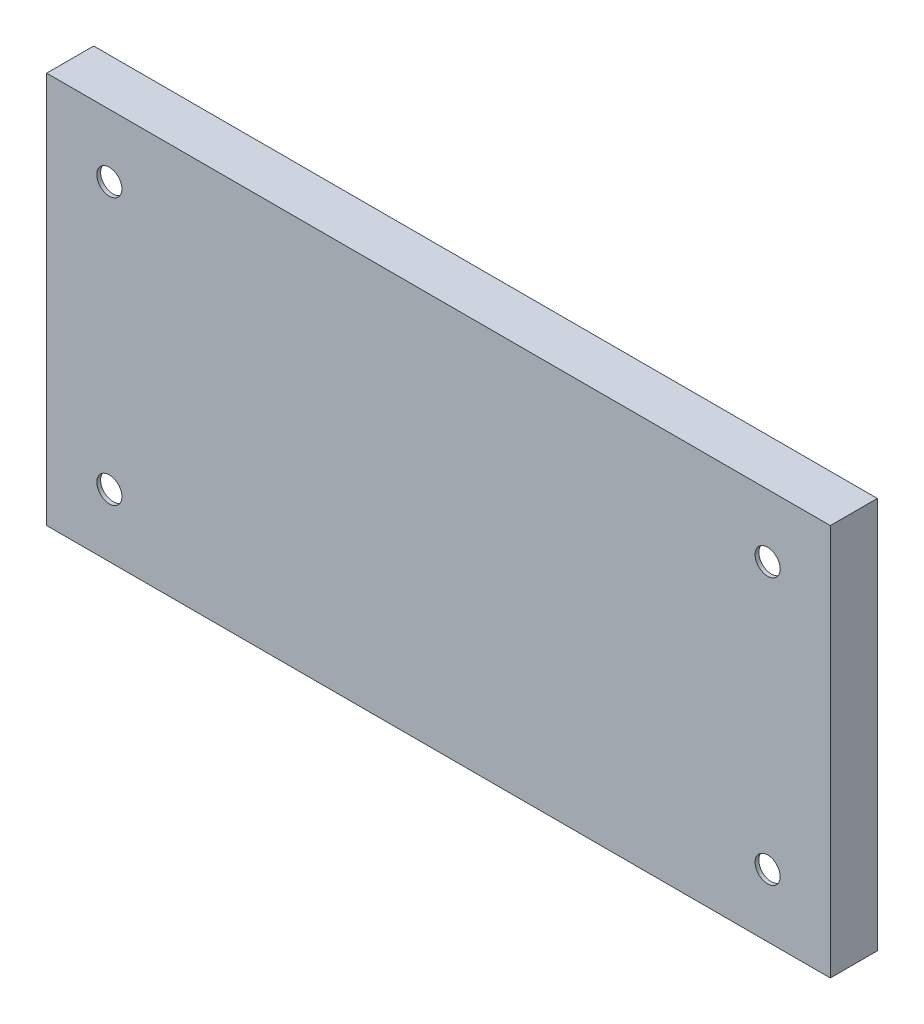
ISO-10303-21;
HEADER;
FILE_DESCRIPTION(('STEP AP214'),'2;1');
FILE_NAME('part.step','',(''),(''),'','','');
FILE_SCHEMA(('AUTOMOTIVE_DESIGN { 1 0 10303 214 1 1 1 1 }'));
ENDSEC;
DATA;
#1=APPLICATION_CONTEXT('core data for automotive mechanical design processes');
#2=APPLICATION_PROTOCOL_DEFINITION('international standard','automotive_design',2000,#1);
#3=PRODUCT_CONTEXT('',#1,'mechanical');
#4=PRODUCT('Part','Part','',(#3));
#5=PRODUCT_RELATED_PRODUCT_CATEGORY('part','',(#4));
#6=PRODUCT_DEFINITION_FORMATION('','',#4);
#7=PRODUCT_DEFINITION_CONTEXT('part definition',#1,'design');
#8=PRODUCT_DEFINITION('design','',#6,#7);
#9=PRODUCT_DEFINITION_SHAPE('','',#8);
#10=(LENGTH_UNIT() NAMED_UNIT(*) SI_UNIT(.MILLI.,.METRE.));
#11=(NAMED_UNIT(*) PLANE_ANGLE_UNIT() SI_UNIT($,.RADIAN.));
#12=(NAMED_UNIT(*) SI_UNIT($,.STERADIAN.) SOLID_ANGLE_UNIT());
#13=UNCERTAINTY_MEASURE_WITH_UNIT(LENGTH_MEASURE(1.E-05),#10,'distance_accuracy_value','');
#14=(GEOMETRIC_REPRESENTATION_CONTEXT(3) GLOBAL_UNCERTAINTY_ASSIGNED_CONTEXT((#13)) GLOBAL_UNIT_ASSIGNED_CONTEXT((#10,
#11,#12)) REPRESENTATION_CONTEXT('',''));
#15=CARTESIAN_POINT('',(0.,0.,0.));
#16=DIRECTION('',(0.,0.,1.));
#17=DIRECTION('',(1.,0.,0.));
#18=AXIS2_PLACEMENT_3D('',#15,#16,#17);
#19=CARTESIAN_POINT('',(-125.,-62.5,15.));
#20=DIRECTION('',(0.,1.,0.));
#21=DIRECTION('',(-1.,0.,0.));
#22=AXIS2_PLACEMENT_3D('',#19,#20,#21);
#23=PLANE('',#22);
#24=DIRECTION('',(1.,0.,0.));
#25=VECTOR('',#24,1.);
#26=CARTESIAN_POINT('',(-125.,-62.5,0.));
#27=LINE('',#26,#25);
#28=CARTESIAN_POINT('',(-125.,-62.5,0.));
#29=VERTEX_POINT('',#28);
#30=CARTESIAN_POINT('',(125.,-62.5,0.));
#31=VERTEX_POINT('',#30);
#32=EDGE_CURVE('E132',#29,#31,#27,.T.);
#33=ORIENTED_EDGE('',*,*,#32,.T.);
#34=DIRECTION('',(0.,0.,-1.));
#35=VECTOR('',#34,1.);
#36=CARTESIAN_POINT('',(125.,-62.5,15.));
#37=LINE('',#36,#35);
#38=CARTESIAN_POINT('',(125.,-62.5,15.));
#39=VERTEX_POINT('',#38);
#40=EDGE_CURVE('E11',#39,#31,#37,.T.);
#41=ORIENTED_EDGE('',*,*,#40,.F.);
#42=DIRECTION('',(1.,0.,0.));
#43=VECTOR('',#42,1.);
#44=CARTESIAN_POINT('',(-125.,-62.5,15.));
#45=LINE('',#44,#43);
#46=CARTESIAN_POINT('',(-125.,-62.5,15.));
#47=VERTEX_POINT('',#46);
#48=EDGE_CURVE('E156',#47,#39,#45,.T.);
#49=ORIENTED_EDGE('',*,*,#48,.F.);
#50=DIRECTION('',(0.,0.,-1.));
#51=VECTOR('',#50,1.);
#52=CARTESIAN_POINT('',(-125.,-62.5,15.));
#53=LINE('',#52,#51);
#54=EDGE_CURVE('E161',#47,#29,#53,.T.);
#55=ORIENTED_EDGE('',*,*,#54,.T.);
#56=EDGE_LOOP('',(#33,#41,#49,#55));
#57=FACE_BOUND('',#56,.T.);
#58=ADVANCED_FACE('F34',(#57),#23,.F.);
#59=CARTESIAN_POINT('',(125.,-62.5,15.));
#60=DIRECTION('',(-1.,0.,0.));
#61=DIRECTION('',(0.,0.,1.));
#62=AXIS2_PLACEMENT_3D('',#59,#60,#61);
#63=PLANE('',#62);
#64=DIRECTION('',(0.,1.,0.));
#65=VECTOR('',#64,1.);
#66=CARTESIAN_POINT('',(125.,-62.5,0.));
#67=LINE('',#66,#65);
#68=CARTESIAN_POINT('',(125.,62.5,0.));
#69=VERTEX_POINT('',#68);
#70=EDGE_CURVE('E136',#31,#69,#67,.T.);
#71=ORIENTED_EDGE('',*,*,#70,.T.);
#72=DIRECTION('',(0.,0.,-1.));
#73=VECTOR('',#72,1.);
#74=CARTESIAN_POINT('',(125.,62.5,15.));
#75=LINE('',#74,#73);
#76=CARTESIAN_POINT('',(125.,62.5,15.));
#77=VERTEX_POINT('',#76);
#78=EDGE_CURVE('E42',#77,#69,#75,.T.);
#79=ORIENTED_EDGE('',*,*,#78,.F.);
#80=DIRECTION('',(0.,1.,0.));
#81=VECTOR('',#80,1.);
#82=CARTESIAN_POINT('',(125.,-62.5,15.));
#83=LINE('',#82,#81);
#84=EDGE_CURVE('E87',#39,#77,#83,.T.);
#85=ORIENTED_EDGE('',*,*,#84,.F.);
#86=ORIENTED_EDGE('',*,*,#40,.T.);
#87=EDGE_LOOP('',(#71,#79,#85,#86));
#88=FACE_BOUND('',#87,.T.);
#89=ADVANCED_FACE('F200',(#88),#63,.F.);
#90=CARTESIAN_POINT('',(-125.,62.5,15.));
#91=DIRECTION('',(0.,-1.,0.));
#92=DIRECTION('',(0.,0.,-1.));
#93=AXIS2_PLACEMENT_3D('',#90,#91,#92);
#94=PLANE('',#93);
#95=DIRECTION('',(-1.,0.,0.));
#96=VECTOR('',#95,1.);
#97=CARTESIAN_POINT('',(-125.,62.5,0.));
#98=LINE('',#97,#96);
#99=CARTESIAN_POINT('',(-125.,62.5,0.));
#100=VERTEX_POINT('',#99);
#101=EDGE_CURVE('E164',#69,#100,#98,.T.);
#102=ORIENTED_EDGE('',*,*,#101,.T.);
#103=DIRECTION('',(0.,0.,-1.));
#104=VECTOR('',#103,1.);
#105=CARTESIAN_POINT('',(-125.,62.5,15.));
#106=LINE('',#105,#104);
#107=CARTESIAN_POINT('',(-125.,62.5,15.));
#108=VERTEX_POINT('',#107);
#109=EDGE_CURVE('E168',#108,#100,#106,.T.);
#110=ORIENTED_EDGE('',*,*,#109,.F.);
#111=DIRECTION('',(-1.,0.,0.));
#112=VECTOR('',#111,1.);
#113=CARTESIAN_POINT('',(-125.,62.5,15.));
#114=LINE('',#113,#112);
#115=EDGE_CURVE('E159',#77,#108,#114,.T.);
#116=ORIENTED_EDGE('',*,*,#115,.F.);
#117=ORIENTED_EDGE('',*,*,#78,.T.);
#118=EDGE_LOOP('',(#102,#110,#116,#117));
#119=FACE_BOUND('',#118,.T.);
#120=ADVANCED_FACE('F205',(#119),#94,.F.);
#121=CARTESIAN_POINT('',(-125.,-62.5,15.));
#122=DIRECTION('',(1.,0.,0.));
#123=DIRECTION('',(0.,0.,-1.));
#124=AXIS2_PLACEMENT_3D('',#121,#122,#123);
#125=PLANE('',#124);
#126=DIRECTION('',(0.,-1.,0.));
#127=VECTOR('',#126,1.);
#128=CARTESIAN_POINT('',(-125.,-62.5,0.));
#129=LINE('',#128,#127);
#130=EDGE_CURVE('E80',#100,#29,#129,.T.);
#131=ORIENTED_EDGE('',*,*,#130,.T.);
#132=ORIENTED_EDGE('',*,*,#54,.F.);
#133=DIRECTION('',(0.,-1.,0.));
#134=VECTOR('',#133,1.);
#135=CARTESIAN_POINT('',(-125.,-62.5,15.));
#136=LINE('',#135,#134);
#137=EDGE_CURVE('E59',#108,#47,#136,.T.);
#138=ORIENTED_EDGE('',*,*,#137,.F.);
#139=ORIENTED_EDGE('',*,*,#109,.T.);
#140=EDGE_LOOP('',(#131,#132,#138,#139));
#141=FACE_BOUND('',#140,.T.);
#142=ADVANCED_FACE('F193',(#141),#125,.F.);
#143=CARTESIAN_POINT('',(0.,0.,15.));
#144=DIRECTION('',(0.,0.,1.));
#145=DIRECTION('',(1.,0.,0.));
#146=AXIS2_PLACEMENT_3D('',#143,#144,#145);
#147=PLANE('',#146);
#148=CARTESIAN_POINT('',(105.,42.5,15.));
#149=DIRECTION('',(0.,0.,1.));
#150=DIRECTION('',(-1.,0.,0.));
#151=AXIS2_PLACEMENT_3D('',#148,#149,#150);
#152=CIRCLE('',#151,4.00000000000001);
#153=CARTESIAN_POINT('',(101.,42.5,15.));
#154=VERTEX_POINT('',#153);
#155=EDGE_CURVE('E177',#154,#154,#152,.T.);
#156=ORIENTED_EDGE('',*,*,#155,.F.);
#157=EDGE_LOOP('',(#156));
#158=FACE_BOUND('',#157,.T.);
#159=CARTESIAN_POINT('',(105.,-42.5,15.));
#160=DIRECTION('',(0.,0.,1.));
#161=DIRECTION('',(1.,0.,0.));
#162=AXIS2_PLACEMENT_3D('',#159,#160,#161);
#163=CIRCLE('',#162,4.00000000000001);
#164=CARTESIAN_POINT('',(109.,-42.5,15.));
#165=VERTEX_POINT('',#164);
#166=EDGE_CURVE('E324',#165,#165,#163,.T.);
#167=ORIENTED_EDGE('',*,*,#166,.F.);
#168=EDGE_LOOP('',(#167));
#169=FACE_BOUND('',#168,.T.);
#170=CARTESIAN_POINT('',(-105.,-42.5,15.));
#171=DIRECTION('',(0.,0.,1.));
#172=DIRECTION('',(-1.,0.,0.));
#173=AXIS2_PLACEMENT_3D('',#170,#171,#172);
#174=CIRCLE('',#173,4.00000000000001);
#175=CARTESIAN_POINT('',(-109.,-42.5,15.));
#176=VERTEX_POINT('',#175);
#177=EDGE_CURVE('E327',#176,#176,#174,.T.);
#178=ORIENTED_EDGE('',*,*,#177,.F.);
#179=EDGE_LOOP('',(#178));
#180=FACE_BOUND('',#179,.T.);
#181=CARTESIAN_POINT('',(-105.,42.5,15.));
#182=DIRECTION('',(0.,0.,1.));
#183=DIRECTION('',(1.,0.,0.));
#184=AXIS2_PLACEMENT_3D('',#181,#182,#183);
#185=CIRCLE('',#184,4.00000000000001);
#186=CARTESIAN_POINT('',(-101.,42.5,15.));
#187=VERTEX_POINT('',#186);
#188=EDGE_CURVE('E141',#187,#187,#185,.T.);
#189=ORIENTED_EDGE('',*,*,#188,.F.);
#190=EDGE_LOOP('',(#189));
#191=FACE_BOUND('',#190,.T.);
#192=ORIENTED_EDGE('',*,*,#48,.T.);
#193=ORIENTED_EDGE('',*,*,#84,.T.);
#194=ORIENTED_EDGE('',*,*,#115,.T.);
#195=ORIENTED_EDGE('',*,*,#137,.T.);
#196=EDGE_LOOP('',(#192,#193,#194,#195));
#197=FACE_BOUND('',#196,.T.);
#198=ADVANCED_FACE('F190',(#158,#169,#180,#191,#197),#147,.T.);
#199=CARTESIAN_POINT('',(0.,0.,0.));
#200=DIRECTION('',(0.,0.,1.));
#201=DIRECTION('',(1.,0.,0.));
#202=AXIS2_PLACEMENT_3D('',#199,#200,#201);
#203=PLANE('',#202);
#204=DIRECTION('',(0.,-1.,0.));
#205=VECTOR('',#204,1.);
#206=CARTESIAN_POINT('',(-123.8,-62.5,0.));
#207=LINE('',#206,#205);
#208=CARTESIAN_POINT('',(-123.8,61.3,0.));
#209=VERTEX_POINT('',#208);
#210=CARTESIAN_POINT('',(-123.8,-61.3,0.));
#211=VERTEX_POINT('',#210);
#212=EDGE_CURVE('E127',#209,#211,#207,.T.);
#213=ORIENTED_EDGE('',*,*,#212,.T.);
#214=DIRECTION('',(1.,0.,0.));
#215=VECTOR('',#214,1.);
#216=CARTESIAN_POINT('',(-125.,-61.3,0.));
#217=LINE('',#216,#215);
#218=CARTESIAN_POINT('',(123.8,-61.3,0.));
#219=VERTEX_POINT('',#218);
#220=EDGE_CURVE('E149',#211,#219,#217,.T.);
#221=ORIENTED_EDGE('',*,*,#220,.T.);
#222=DIRECTION('',(0.,1.,0.));
#223=VECTOR('',#222,1.);
#224=CARTESIAN_POINT('',(123.8,-62.5,0.));
#225=LINE('',#224,#223);
#226=CARTESIAN_POINT('',(123.8,61.3,0.));
#227=VERTEX_POINT('',#226);
#228=EDGE_CURVE('E131',#219,#227,#225,.T.);
#229=ORIENTED_EDGE('',*,*,#228,.T.);
#230=DIRECTION('',(-1.,0.,0.));
#231=VECTOR('',#230,1.);
#232=CARTESIAN_POINT('',(-125.,61.3,0.));
#233=LINE('',#232,#231);
#234=EDGE_CURVE('E50',#227,#209,#233,.T.);
#235=ORIENTED_EDGE('',*,*,#234,.T.);
#236=EDGE_LOOP('',(#213,#221,#229,#235));
#237=FACE_BOUND('',#236,.T.);
#238=ORIENTED_EDGE('',*,*,#32,.F.);
#239=ORIENTED_EDGE('',*,*,#130,.F.);
#240=ORIENTED_EDGE('',*,*,#101,.F.);
#241=ORIENTED_EDGE('',*,*,#70,.F.);
#242=EDGE_LOOP('',(#238,#239,#240,#241));
#243=FACE_BOUND('',#242,.T.);
#244=ADVANCED_FACE('F192',(#237,#243),#203,.F.);
#245=CARTESIAN_POINT('',(-125.,-61.3,15.));
#246=DIRECTION('',(0.,1.,0.));
#247=DIRECTION('',(-1.,0.,0.));
#248=AXIS2_PLACEMENT_3D('',#245,#246,#247);
#249=PLANE('',#248);
#250=ORIENTED_EDGE('',*,*,#220,.F.);
#251=DIRECTION('',(0.,0.,-1.));
#252=VECTOR('',#251,1.);
#253=CARTESIAN_POINT('',(-123.8,-61.3,15.));
#254=LINE('',#253,#252);
#255=CARTESIAN_POINT('',(-123.8,-61.3,13.8));
#256=VERTEX_POINT('',#255);
#257=EDGE_CURVE('E126',#256,#211,#254,.T.);
#258=ORIENTED_EDGE('',*,*,#257,.F.);
#259=DIRECTION('',(1.,0.,0.));
#260=VECTOR('',#259,1.);
#261=CARTESIAN_POINT('',(-125.,-61.3,13.8));
#262=LINE('',#261,#260);
#263=CARTESIAN_POINT('',(123.8,-61.3,13.8));
#264=VERTEX_POINT('',#263);
#265=EDGE_CURVE('E114',#256,#264,#262,.T.);
#266=ORIENTED_EDGE('',*,*,#265,.T.);
#267=DIRECTION('',(0.,0.,-1.));
#268=VECTOR('',#267,1.);
#269=CARTESIAN_POINT('',(123.8,-61.3,15.));
#270=LINE('',#269,#268);
#271=EDGE_CURVE('E124',#264,#219,#270,.T.);
#272=ORIENTED_EDGE('',*,*,#271,.T.);
#273=EDGE_LOOP('',(#250,#258,#266,#272));
#274=FACE_BOUND('',#273,.T.);
#275=ADVANCED_FACE('F123',(#274),#249,.T.);
#276=CARTESIAN_POINT('',(123.8,-62.5,15.));
#277=DIRECTION('',(-1.,0.,0.));
#278=DIRECTION('',(0.,0.,1.));
#279=AXIS2_PLACEMENT_3D('',#276,#277,#278);
#280=PLANE('',#279);
#281=ORIENTED_EDGE('',*,*,#228,.F.);
#282=ORIENTED_EDGE('',*,*,#271,.F.);
#283=DIRECTION('',(0.,1.,0.));
#284=VECTOR('',#283,1.);
#285=CARTESIAN_POINT('',(123.8,-62.5,13.8));
#286=LINE('',#285,#284);
#287=CARTESIAN_POINT('',(123.8,61.3,13.8));
#288=VERTEX_POINT('',#287);
#289=EDGE_CURVE('E110',#264,#288,#286,.T.);
#290=ORIENTED_EDGE('',*,*,#289,.T.);
#291=DIRECTION('',(0.,0.,-1.));
#292=VECTOR('',#291,1.);
#293=CARTESIAN_POINT('',(123.8,61.3,15.));
#294=LINE('',#293,#292);
#295=EDGE_CURVE('E133',#288,#227,#294,.T.);
#296=ORIENTED_EDGE('',*,*,#295,.T.);
#297=EDGE_LOOP('',(#281,#282,#290,#296));
#298=FACE_BOUND('',#297,.T.);
#299=ADVANCED_FACE('F129',(#298),#280,.T.);
#300=CARTESIAN_POINT('',(-125.,61.3,15.));
#301=DIRECTION('',(0.,-1.,0.));
#302=DIRECTION('',(0.,0.,-1.));
#303=AXIS2_PLACEMENT_3D('',#300,#301,#302);
#304=PLANE('',#303);
#305=ORIENTED_EDGE('',*,*,#234,.F.);
#306=ORIENTED_EDGE('',*,*,#295,.F.);
#307=DIRECTION('',(-1.,0.,0.));
#308=VECTOR('',#307,1.);
#309=CARTESIAN_POINT('',(-125.,61.3,13.8));
#310=LINE('',#309,#308);
#311=CARTESIAN_POINT('',(-123.8,61.3,13.8));
#312=VERTEX_POINT('',#311);
#313=EDGE_CURVE('E115',#288,#312,#310,.T.);
#314=ORIENTED_EDGE('',*,*,#313,.T.);
#315=DIRECTION('',(0.,0.,-1.));
#316=VECTOR('',#315,1.);
#317=CARTESIAN_POINT('',(-123.8,61.3,15.));
#318=LINE('',#317,#316);
#319=EDGE_CURVE('E138',#312,#209,#318,.T.);
#320=ORIENTED_EDGE('',*,*,#319,.T.);
#321=EDGE_LOOP('',(#305,#306,#314,#320));
#322=FACE_BOUND('',#321,.T.);
#323=ADVANCED_FACE('F292',(#322),#304,.T.);
#324=CARTESIAN_POINT('',(-123.8,-62.5,15.));
#325=DIRECTION('',(1.,0.,0.));
#326=DIRECTION('',(0.,0.,-1.));
#327=AXIS2_PLACEMENT_3D('',#324,#325,#326);
#328=PLANE('',#327);
#329=ORIENTED_EDGE('',*,*,#212,.F.);
#330=ORIENTED_EDGE('',*,*,#319,.F.);
#331=DIRECTION('',(0.,-1.,0.));
#332=VECTOR('',#331,1.);
#333=CARTESIAN_POINT('',(-123.8,-62.5,13.8));
#334=LINE('',#333,#332);
#335=EDGE_CURVE('E144',#312,#256,#334,.T.);
#336=ORIENTED_EDGE('',*,*,#335,.T.);
#337=ORIENTED_EDGE('',*,*,#257,.T.);
#338=EDGE_LOOP('',(#329,#330,#336,#337));
#339=FACE_BOUND('',#338,.T.);
#340=ADVANCED_FACE('F239',(#339),#328,.T.);
#341=CARTESIAN_POINT('',(0.,0.,13.8));
#342=DIRECTION('',(0.,0.,1.));
#343=DIRECTION('',(1.,0.,0.));
#344=AXIS2_PLACEMENT_3D('',#341,#342,#343);
#345=PLANE('',#344);
#346=CARTESIAN_POINT('',(105.,42.5,13.8));
#347=DIRECTION('',(0.,0.,1.));
#348=DIRECTION('',(1.,0.,0.));
#349=AXIS2_PLACEMENT_3D('',#346,#347,#348);
#350=CIRCLE('',#349,4.00000000000001);
#351=CARTESIAN_POINT('',(109.,42.5,13.8));
#352=VERTEX_POINT('',#351);
#353=EDGE_CURVE('E37',#352,#352,#350,.T.);
#354=ORIENTED_EDGE('',*,*,#353,.T.);
#355=EDGE_LOOP('',(#354));
#356=FACE_BOUND('',#355,.T.);
#357=CARTESIAN_POINT('',(105.,-42.5,13.8));
#358=DIRECTION('',(0.,0.,1.));
#359=DIRECTION('',(1.,0.,0.));
#360=AXIS2_PLACEMENT_3D('',#357,#358,#359);
#361=CIRCLE('',#360,4.00000000000001);
#362=CARTESIAN_POINT('',(109.,-42.5,13.8));
#363=VERTEX_POINT('',#362);
#364=EDGE_CURVE('E176',#363,#363,#361,.T.);
#365=ORIENTED_EDGE('',*,*,#364,.T.);
#366=EDGE_LOOP('',(#365));
#367=FACE_BOUND('',#366,.T.);
#368=CARTESIAN_POINT('',(-105.,-42.5,13.8));
#369=DIRECTION('',(0.,0.,1.));
#370=DIRECTION('',(1.,0.,0.));
#371=AXIS2_PLACEMENT_3D('',#368,#369,#370);
#372=CIRCLE('',#371,4.00000000000001);
#373=CARTESIAN_POINT('',(-101.,-42.5,13.8));
#374=VERTEX_POINT('',#373);
#375=EDGE_CURVE('E174',#374,#374,#372,.T.);
#376=ORIENTED_EDGE('',*,*,#375,.T.);
#377=EDGE_LOOP('',(#376));
#378=FACE_BOUND('',#377,.T.);
#379=CARTESIAN_POINT('',(-105.,42.5,13.8));
#380=DIRECTION('',(0.,0.,1.));
#381=DIRECTION('',(1.,0.,0.));
#382=AXIS2_PLACEMENT_3D('',#379,#380,#381);
#383=CIRCLE('',#382,4.00000000000001);
#384=CARTESIAN_POINT('',(-101.,42.5,13.8));
#385=VERTEX_POINT('',#384);
#386=EDGE_CURVE('E151',#385,#385,#383,.T.);
#387=ORIENTED_EDGE('',*,*,#386,.T.);
#388=EDGE_LOOP('',(#387));
#389=FACE_BOUND('',#388,.T.);
#390=ORIENTED_EDGE('',*,*,#265,.F.);
#391=ORIENTED_EDGE('',*,*,#335,.F.);
#392=ORIENTED_EDGE('',*,*,#313,.F.);
#393=ORIENTED_EDGE('',*,*,#289,.F.);
#394=EDGE_LOOP('',(#390,#391,#392,#393));
#395=FACE_BOUND('',#394,.T.);
#396=ADVANCED_FACE('F112',(#356,#367,#378,#389,#395),#345,.F.);
#397=CARTESIAN_POINT('',(-105.,42.5,0.));
#398=DIRECTION('',(0.,0.,1.));
#399=DIRECTION('',(1.,0.,0.));
#400=AXIS2_PLACEMENT_3D('',#397,#398,#399);
#401=CYLINDRICAL_SURFACE('',#400,4.00000000000001);
#402=ORIENTED_EDGE('',*,*,#188,.T.);
#403=EDGE_LOOP('',(#402));
#404=FACE_BOUND('',#403,.T.);
#405=ORIENTED_EDGE('',*,*,#386,.F.);
#406=EDGE_LOOP('',(#405));
#407=FACE_BOUND('',#406,.T.);
#408=ADVANCED_FACE('F187',(#404,#407),#401,.F.);
#409=CARTESIAN_POINT('',(-105.,-42.5,0.));
#410=DIRECTION('',(0.,0.,1.));
#411=DIRECTION('',(1.,0.,0.));
#412=AXIS2_PLACEMENT_3D('',#409,#410,#411);
#413=CYLINDRICAL_SURFACE('',#412,4.00000000000001);
#414=ORIENTED_EDGE('',*,*,#177,.T.);
#415=EDGE_LOOP('',(#414));
#416=FACE_BOUND('',#415,.T.);
#417=ORIENTED_EDGE('',*,*,#375,.F.);
#418=EDGE_LOOP('',(#417));
#419=FACE_BOUND('',#418,.T.);
#420=ADVANCED_FACE('F254',(#416,#419),#413,.F.);
#421=CARTESIAN_POINT('',(105.,-42.5,0.));
#422=DIRECTION('',(0.,0.,1.));
#423=DIRECTION('',(1.,0.,0.));
#424=AXIS2_PLACEMENT_3D('',#421,#422,#423);
#425=CYLINDRICAL_SURFACE('',#424,4.00000000000001);
#426=ORIENTED_EDGE('',*,*,#166,.T.);
#427=EDGE_LOOP('',(#426));
#428=FACE_BOUND('',#427,.T.);
#429=ORIENTED_EDGE('',*,*,#364,.F.);
#430=EDGE_LOOP('',(#429));
#431=FACE_BOUND('',#430,.T.);
#432=ADVANCED_FACE('F263',(#428,#431),#425,.F.);
#433=CARTESIAN_POINT('',(105.,42.5,0.));
#434=DIRECTION('',(0.,0.,1.));
#435=DIRECTION('',(1.,0.,0.));
#436=AXIS2_PLACEMENT_3D('',#433,#434,#435);
#437=CYLINDRICAL_SURFACE('',#436,4.00000000000001);
#438=ORIENTED_EDGE('',*,*,#155,.T.);
#439=EDGE_LOOP('',(#438));
#440=FACE_BOUND('',#439,.T.);
#441=ORIENTED_EDGE('',*,*,#353,.F.);
#442=EDGE_LOOP('',(#441));
#443=FACE_BOUND('',#442,.T.);
#444=ADVANCED_FACE('F273',(#440,#443),#437,.F.);
#445=CLOSED_SHELL('',(#58,#89,#120,#142,#198,#244,#275,#299,#323,#340,#396,#408,#420,#432,#444));
#446=MANIFOLD_SOLID_BREP('B2',#445);
#447=ADVANCED_BREP_SHAPE_REPRESENTATION('',(#18,#446),#14);
#448=SHAPE_DEFINITION_REPRESENTATION(#9,#447);
ENDSEC;
END-ISO-10303-21;
